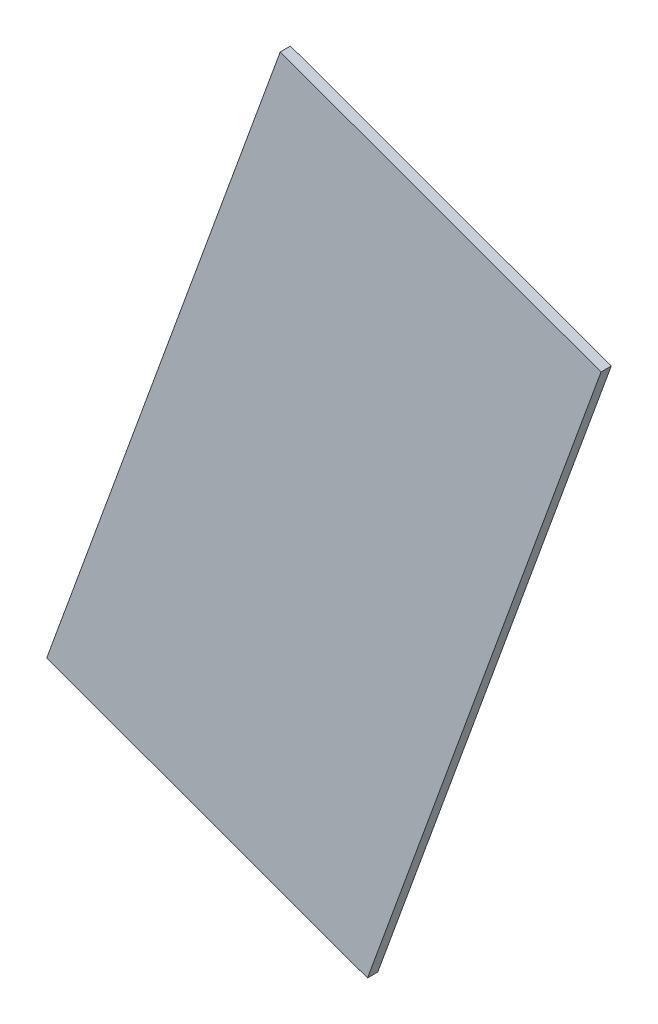
ISO-10303-21;
HEADER;
FILE_DESCRIPTION(('STEP AP214'),'2;1');
FILE_NAME('part.step','',(''),(''),'','','');
FILE_SCHEMA(('AUTOMOTIVE_DESIGN { 1 0 10303 214 1 1 1 1 }'));
ENDSEC;
DATA;
#1=APPLICATION_CONTEXT('core data for automotive mechanical design processes');
#2=APPLICATION_PROTOCOL_DEFINITION('international standard','automotive_design',2000,#1);
#3=PRODUCT_CONTEXT('',#1,'mechanical');
#4=PRODUCT('Part','Part','',(#3));
#5=PRODUCT_RELATED_PRODUCT_CATEGORY('part','',(#4));
#6=PRODUCT_DEFINITION_FORMATION('','',#4);
#7=PRODUCT_DEFINITION_CONTEXT('part definition',#1,'design');
#8=PRODUCT_DEFINITION('design','',#6,#7);
#9=PRODUCT_DEFINITION_SHAPE('','',#8);
#10=(LENGTH_UNIT() NAMED_UNIT(*) SI_UNIT(.MILLI.,.METRE.));
#11=(NAMED_UNIT(*) PLANE_ANGLE_UNIT() SI_UNIT($,.RADIAN.));
#12=(NAMED_UNIT(*) SI_UNIT($,.STERADIAN.) SOLID_ANGLE_UNIT());
#13=UNCERTAINTY_MEASURE_WITH_UNIT(LENGTH_MEASURE(1.E-05),#10,'distance_accuracy_value','');
#14=(GEOMETRIC_REPRESENTATION_CONTEXT(3) GLOBAL_UNCERTAINTY_ASSIGNED_CONTEXT((#13)) GLOBAL_UNIT_ASSIGNED_CONTEXT((#10,
#11,#12)) REPRESENTATION_CONTEXT('',''));
#15=CARTESIAN_POINT('',(0.,0.,0.));
#16=DIRECTION('',(0.,0.,1.));
#17=DIRECTION('',(1.,0.,0.));
#18=AXIS2_PLACEMENT_3D('',#15,#16,#17);
#19=CARTESIAN_POINT('',(413.792962610629,649.964583032028,3.));
#20=DIRECTION('',(0.342020143325665,0.93969262078591,0.));
#21=DIRECTION('',(-0.93969262078591,0.342020143325665,0.));
#22=AXIS2_PLACEMENT_3D('',#19,#20,#21);
#23=PLANE('',#22);
#24=DIRECTION('',(0.93969262078591,-0.342020143325665,0.));
#25=VECTOR('',#24,1.);
#26=CARTESIAN_POINT('',(413.792962610629,649.964583032028,0.));
#27=LINE('',#26,#25);
#28=CARTESIAN_POINT('',(319.823700532038,684.166597364594,0.));
#29=VERTEX_POINT('',#28);
#30=CARTESIAN_POINT('',(413.792962610629,649.964583032028,0.));
#31=VERTEX_POINT('',#30);
#32=EDGE_CURVE('E104',#29,#31,#27,.T.);
#33=ORIENTED_EDGE('',*,*,#32,.T.);
#34=DIRECTION('',(0.,0.,-1.));
#35=VECTOR('',#34,1.);
#36=CARTESIAN_POINT('',(413.792962610629,649.964583032028,3.));
#37=LINE('',#36,#35);
#38=CARTESIAN_POINT('',(413.792962610629,649.964583032028,3.));
#39=VERTEX_POINT('',#38);
#40=EDGE_CURVE('E11',#39,#31,#37,.T.);
#41=ORIENTED_EDGE('',*,*,#40,.F.);
#42=DIRECTION('',(0.93969262078591,-0.342020143325665,0.));
#43=VECTOR('',#42,1.);
#44=CARTESIAN_POINT('',(413.792962610629,649.964583032028,3.));
#45=LINE('',#44,#43);
#46=CARTESIAN_POINT('',(319.823700532038,684.166597364594,3.));
#47=VERTEX_POINT('',#46);
#48=EDGE_CURVE('E92',#47,#39,#45,.T.);
#49=ORIENTED_EDGE('',*,*,#48,.F.);
#50=DIRECTION('',(0.,0.,-1.));
#51=VECTOR('',#50,1.);
#52=CARTESIAN_POINT('',(319.823700532038,684.166597364594,3.));
#53=LINE('',#52,#51);
#54=EDGE_CURVE('E100',#47,#29,#53,.T.);
#55=ORIENTED_EDGE('',*,*,#54,.T.);
#56=EDGE_LOOP('',(#33,#41,#49,#55));
#57=FACE_BOUND('',#56,.T.);
#58=ADVANCED_FACE('F41',(#57),#23,.F.);
#59=CARTESIAN_POINT('',(413.792962610629,649.964583032028,3.));
#60=DIRECTION('',(-0.93969262078591,0.342020143325665,0.));
#61=DIRECTION('',(-0.342020143325665,-0.93969262078591,0.));
#62=AXIS2_PLACEMENT_3D('',#59,#60,#61);
#63=PLANE('',#62);
#64=DIRECTION('',(0.342020143325665,0.93969262078591,0.));
#65=VECTOR('',#64,1.);
#66=CARTESIAN_POINT('',(413.792962610629,649.964583032028,0.));
#67=LINE('',#66,#65);
#68=CARTESIAN_POINT('',(482.196991275762,837.90310718921,0.));
#69=VERTEX_POINT('',#68);
#70=EDGE_CURVE('E96',#31,#69,#67,.T.);
#71=ORIENTED_EDGE('',*,*,#70,.T.);
#72=DIRECTION('',(0.,0.,-1.));
#73=VECTOR('',#72,1.);
#74=CARTESIAN_POINT('',(482.196991275762,837.90310718921,3.));
#75=LINE('',#74,#73);
#76=CARTESIAN_POINT('',(482.196991275762,837.90310718921,3.));
#77=VERTEX_POINT('',#76);
#78=EDGE_CURVE('E49',#77,#69,#75,.T.);
#79=ORIENTED_EDGE('',*,*,#78,.F.);
#80=DIRECTION('',(0.342020143325665,0.93969262078591,0.));
#81=VECTOR('',#80,1.);
#82=CARTESIAN_POINT('',(413.792962610629,649.964583032028,3.));
#83=LINE('',#82,#81);
#84=EDGE_CURVE('E87',#39,#77,#83,.T.);
#85=ORIENTED_EDGE('',*,*,#84,.F.);
#86=ORIENTED_EDGE('',*,*,#40,.T.);
#87=EDGE_LOOP('',(#71,#79,#85,#86));
#88=FACE_BOUND('',#87,.T.);
#89=ADVANCED_FACE('F95',(#88),#63,.F.);
#90=CARTESIAN_POINT('',(482.196991275762,837.90310718921,3.));
#91=DIRECTION('',(-0.342020143325665,-0.93969262078591,0.));
#92=DIRECTION('',(0.93969262078591,-0.342020143325665,0.));
#93=AXIS2_PLACEMENT_3D('',#90,#91,#92);
#94=PLANE('',#93);
#95=DIRECTION('',(-0.93969262078591,0.342020143325665,0.));
#96=VECTOR('',#95,1.);
#97=CARTESIAN_POINT('',(482.196991275762,837.90310718921,0.));
#98=LINE('',#97,#96);
#99=CARTESIAN_POINT('',(388.227729197171,872.105121521776,0.));
#100=VERTEX_POINT('',#99);
#101=EDGE_CURVE('E74',#69,#100,#98,.T.);
#102=ORIENTED_EDGE('',*,*,#101,.T.);
#103=DIRECTION('',(0.,0.,-1.));
#104=VECTOR('',#103,1.);
#105=CARTESIAN_POINT('',(388.227729197171,872.105121521776,3.));
#106=LINE('',#105,#104);
#107=CARTESIAN_POINT('',(388.227729197171,872.105121521776,3.));
#108=VERTEX_POINT('',#107);
#109=EDGE_CURVE('E97',#108,#100,#106,.T.);
#110=ORIENTED_EDGE('',*,*,#109,.F.);
#111=DIRECTION('',(-0.93969262078591,0.342020143325665,0.));
#112=VECTOR('',#111,1.);
#113=CARTESIAN_POINT('',(482.196991275762,837.90310718921,3.));
#114=LINE('',#113,#112);
#115=EDGE_CURVE('E90',#77,#108,#114,.T.);
#116=ORIENTED_EDGE('',*,*,#115,.F.);
#117=ORIENTED_EDGE('',*,*,#78,.T.);
#118=EDGE_LOOP('',(#102,#110,#116,#117));
#119=FACE_BOUND('',#118,.T.);
#120=ADVANCED_FACE('F98',(#119),#94,.F.);
#121=CARTESIAN_POINT('',(319.823700532038,684.166597364594,3.));
#122=DIRECTION('',(0.93969262078591,-0.342020143325665,0.));
#123=DIRECTION('',(0.342020143325665,0.93969262078591,0.));
#124=AXIS2_PLACEMENT_3D('',#121,#122,#123);
#125=PLANE('',#124);
#126=DIRECTION('',(-0.342020143325665,-0.93969262078591,0.));
#127=VECTOR('',#126,1.);
#128=CARTESIAN_POINT('',(319.823700532038,684.166597364594,0.));
#129=LINE('',#128,#127);
#130=EDGE_CURVE('E80',#100,#29,#129,.T.);
#131=ORIENTED_EDGE('',*,*,#130,.T.);
#132=ORIENTED_EDGE('',*,*,#54,.F.);
#133=DIRECTION('',(-0.342020143325665,-0.93969262078591,0.));
#134=VECTOR('',#133,1.);
#135=CARTESIAN_POINT('',(319.823700532038,684.166597364594,3.));
#136=LINE('',#135,#134);
#137=EDGE_CURVE('E57',#108,#47,#136,.T.);
#138=ORIENTED_EDGE('',*,*,#137,.F.);
#139=ORIENTED_EDGE('',*,*,#109,.T.);
#140=EDGE_LOOP('',(#131,#132,#138,#139));
#141=FACE_BOUND('',#140,.T.);
#142=ADVANCED_FACE('F111',(#141),#125,.F.);
#143=CARTESIAN_POINT('',(0.,0.,3.));
#144=DIRECTION('',(0.,0.,-1.));
#145=DIRECTION('',(-1.,0.,0.));
#146=AXIS2_PLACEMENT_3D('',#143,#144,#145);
#147=PLANE('',#146);
#148=ORIENTED_EDGE('',*,*,#48,.T.);
#149=ORIENTED_EDGE('',*,*,#84,.T.);
#150=ORIENTED_EDGE('',*,*,#115,.T.);
#151=ORIENTED_EDGE('',*,*,#137,.T.);
#152=EDGE_LOOP('',(#148,#149,#150,#151));
#153=FACE_BOUND('',#152,.T.);
#154=ADVANCED_FACE('F88',(#153),#147,.F.);
#155=CARTESIAN_POINT('',(0.,0.,0.));
#156=DIRECTION('',(0.,0.,-1.));
#157=DIRECTION('',(-1.,0.,0.));
#158=AXIS2_PLACEMENT_3D('',#155,#156,#157);
#159=PLANE('',#158);
#160=ORIENTED_EDGE('',*,*,#32,.F.);
#161=ORIENTED_EDGE('',*,*,#130,.F.);
#162=ORIENTED_EDGE('',*,*,#101,.F.);
#163=ORIENTED_EDGE('',*,*,#70,.F.);
#164=EDGE_LOOP('',(#160,#161,#162,#163));
#165=FACE_BOUND('',#164,.T.);
#166=ADVANCED_FACE('F114',(#165),#159,.T.);
#167=CLOSED_SHELL('',(#58,#89,#120,#142,#154,#166));
#168=MANIFOLD_SOLID_BREP('B2',#167);
#169=ADVANCED_BREP_SHAPE_REPRESENTATION('',(#18,#168),#14);
#170=SHAPE_DEFINITION_REPRESENTATION(#9,#169);
ENDSEC;
END-ISO-10303-21;
